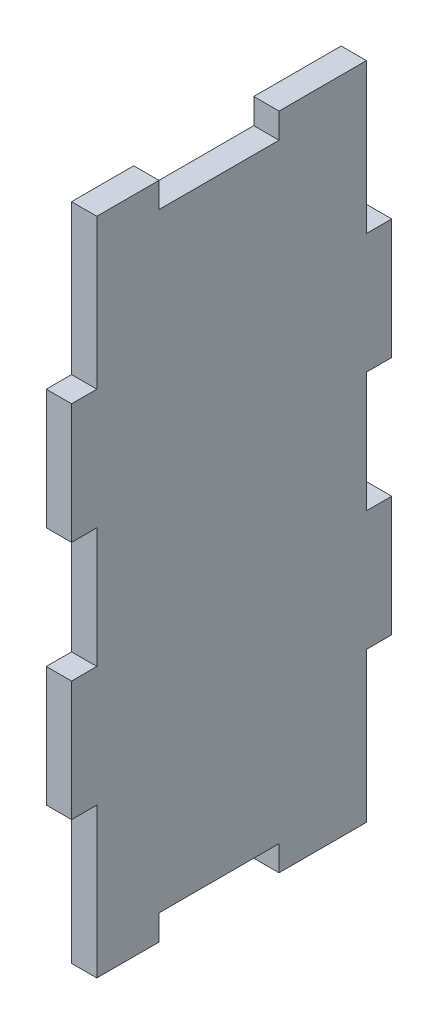
ISO-10303-21;
HEADER;
FILE_DESCRIPTION(('STEP AP214'),'2;1');
FILE_NAME('part.step','',(''),(''),'','','');
FILE_SCHEMA(('AUTOMOTIVE_DESIGN { 1 0 10303 214 1 1 1 1 }'));
ENDSEC;
DATA;
#1=APPLICATION_CONTEXT('core data for automotive mechanical design processes');
#2=APPLICATION_PROTOCOL_DEFINITION('international standard','automotive_design',2000,#1);
#3=PRODUCT_CONTEXT('',#1,'mechanical');
#4=PRODUCT('Part','Part','',(#3));
#5=PRODUCT_RELATED_PRODUCT_CATEGORY('part','',(#4));
#6=PRODUCT_DEFINITION_FORMATION('','',#4);
#7=PRODUCT_DEFINITION_CONTEXT('part definition',#1,'design');
#8=PRODUCT_DEFINITION('design','',#6,#7);
#9=PRODUCT_DEFINITION_SHAPE('','',#8);
#10=(LENGTH_UNIT() NAMED_UNIT(*) SI_UNIT(.MILLI.,.METRE.));
#11=(NAMED_UNIT(*) PLANE_ANGLE_UNIT() SI_UNIT($,.RADIAN.));
#12=(NAMED_UNIT(*) SI_UNIT($,.STERADIAN.) SOLID_ANGLE_UNIT());
#13=UNCERTAINTY_MEASURE_WITH_UNIT(LENGTH_MEASURE(1.E-05),#10,'distance_accuracy_value','');
#14=(GEOMETRIC_REPRESENTATION_CONTEXT(3) GLOBAL_UNCERTAINTY_ASSIGNED_CONTEXT((#13)) GLOBAL_UNIT_ASSIGNED_CONTEXT((#10,
#11,#12)) REPRESENTATION_CONTEXT('',''));
#15=CARTESIAN_POINT('',(0.,0.,0.));
#16=DIRECTION('',(0.,0.,1.));
#17=DIRECTION('',(1.,0.,0.));
#18=AXIS2_PLACEMENT_3D('',#15,#16,#17);
#19=CARTESIAN_POINT('',(3.,37.3293554167655,9.3447237500424));
#20=DIRECTION('',(0.,-1.,0.));
#21=DIRECTION('',(0.,0.,-1.));
#22=AXIS2_PLACEMENT_3D('',#19,#20,#21);
#23=PLANE('',#22);
#24=DIRECTION('',(0.,0.,1.));
#25=VECTOR('',#24,1.);
#26=CARTESIAN_POINT('',(0.,37.3293554167655,9.3447237500424));
#27=LINE('',#26,#25);
#28=CARTESIAN_POINT('',(0.,37.3293554167655,9.3447237500424));
#29=VERTEX_POINT('',#28);
#30=CARTESIAN_POINT('',(0.,37.3293554167655,16.7197237500424));
#31=VERTEX_POINT('',#30);
#32=EDGE_CURVE('E474',#29,#31,#27,.T.);
#33=ORIENTED_EDGE('',*,*,#32,.T.);
#34=DIRECTION('',(-1.,0.,0.));
#35=VECTOR('',#34,1.);
#36=CARTESIAN_POINT('',(3.,37.3293554167655,16.7197237500424));
#37=LINE('',#36,#35);
#38=CARTESIAN_POINT('',(3.,37.3293554167655,16.7197237500424));
#39=VERTEX_POINT('',#38);
#40=EDGE_CURVE('E12',#39,#31,#37,.T.);
#41=ORIENTED_EDGE('',*,*,#40,.F.);
#42=DIRECTION('',(0.,0.,1.));
#43=VECTOR('',#42,1.);
#44=CARTESIAN_POINT('',(3.,37.3293554167655,9.3447237500424));
#45=LINE('',#44,#43);
#46=CARTESIAN_POINT('',(3.,37.3293554167655,9.3447237500424));
#47=VERTEX_POINT('',#46);
#48=EDGE_CURVE('E379',#47,#39,#45,.T.);
#49=ORIENTED_EDGE('',*,*,#48,.F.);
#50=DIRECTION('',(-1.,0.,0.));
#51=VECTOR('',#50,1.);
#52=CARTESIAN_POINT('',(3.,37.3293554167655,9.3447237500424));
#53=LINE('',#52,#51);
#54=EDGE_CURVE('E259',#47,#29,#53,.T.);
#55=ORIENTED_EDGE('',*,*,#54,.T.);
#56=EDGE_LOOP('',(#33,#41,#49,#55));
#57=FACE_BOUND('',#56,.T.);
#58=ADVANCED_FACE('F44',(#57),#23,.F.);
#59=CARTESIAN_POINT('',(3.,37.3293554167655,16.7197237500424));
#60=DIRECTION('',(0.,0.,-1.));
#61=DIRECTION('',(-1.,0.,0.));
#62=AXIS2_PLACEMENT_3D('',#59,#60,#61);
#63=PLANE('',#62);
#64=DIRECTION('',(0.,-1.,0.));
#65=VECTOR('',#64,1.);
#66=CARTESIAN_POINT('',(0.,37.3293554167655,16.7197237500424));
#67=LINE('',#66,#65);
#68=CARTESIAN_POINT('',(0.,19.5543554167655,16.7197237500424));
#69=VERTEX_POINT('',#68);
#70=EDGE_CURVE('E468',#31,#69,#67,.T.);
#71=ORIENTED_EDGE('',*,*,#70,.T.);
#72=DIRECTION('',(-1.,0.,0.));
#73=VECTOR('',#72,1.);
#74=CARTESIAN_POINT('',(3.,19.5543554167655,16.7197237500424));
#75=LINE('',#74,#73);
#76=CARTESIAN_POINT('',(3.,19.5543554167655,16.7197237500424));
#77=VERTEX_POINT('',#76);
#78=EDGE_CURVE('E52',#77,#69,#75,.T.);
#79=ORIENTED_EDGE('',*,*,#78,.F.);
#80=DIRECTION('',(0.,-1.,0.));
#81=VECTOR('',#80,1.);
#82=CARTESIAN_POINT('',(3.,37.3293554167655,16.7197237500424));
#83=LINE('',#82,#81);
#84=EDGE_CURVE('E163',#39,#77,#83,.T.);
#85=ORIENTED_EDGE('',*,*,#84,.F.);
#86=ORIENTED_EDGE('',*,*,#40,.T.);
#87=EDGE_LOOP('',(#71,#79,#85,#86));
#88=FACE_BOUND('',#87,.T.);
#89=ADVANCED_FACE('F536',(#88),#63,.F.);
#90=CARTESIAN_POINT('',(3.,19.5543554167655,16.7197237500424));
#91=DIRECTION('',(0.,-1.,0.));
#92=DIRECTION('',(0.,0.,-1.));
#93=AXIS2_PLACEMENT_3D('',#90,#91,#92);
#94=PLANE('',#93);
#95=DIRECTION('',(0.,0.,1.));
#96=VECTOR('',#95,1.);
#97=CARTESIAN_POINT('',(0.,19.5543554167655,16.7197237500424));
#98=LINE('',#97,#96);
#99=CARTESIAN_POINT('',(0.,19.5543554167655,19.7197237500424));
#100=VERTEX_POINT('',#99);
#101=EDGE_CURVE('E463',#69,#100,#98,.T.);
#102=ORIENTED_EDGE('',*,*,#101,.T.);
#103=DIRECTION('',(-1.,0.,0.));
#104=VECTOR('',#103,1.);
#105=CARTESIAN_POINT('',(3.,19.5543554167655,19.7197237500424));
#106=LINE('',#105,#104);
#107=CARTESIAN_POINT('',(3.,19.5543554167655,19.7197237500424));
#108=VERTEX_POINT('',#107);
#109=EDGE_CURVE('E455',#108,#100,#106,.T.);
#110=ORIENTED_EDGE('',*,*,#109,.F.);
#111=DIRECTION('',(0.,0.,1.));
#112=VECTOR('',#111,1.);
#113=CARTESIAN_POINT('',(3.,19.5543554167655,16.7197237500424));
#114=LINE('',#113,#112);
#115=EDGE_CURVE('E371',#77,#108,#114,.T.);
#116=ORIENTED_EDGE('',*,*,#115,.F.);
#117=ORIENTED_EDGE('',*,*,#78,.T.);
#118=EDGE_LOOP('',(#102,#110,#116,#117));
#119=FACE_BOUND('',#118,.T.);
#120=ADVANCED_FACE('F461',(#119),#94,.F.);
#121=CARTESIAN_POINT('',(3.,19.5543554167655,19.7197237500424));
#122=DIRECTION('',(0.,0.,-1.));
#123=DIRECTION('',(-1.,0.,0.));
#124=AXIS2_PLACEMENT_3D('',#121,#122,#123);
#125=PLANE('',#124);
#126=DIRECTION('',(0.,-1.,0.));
#127=VECTOR('',#126,1.);
#128=CARTESIAN_POINT('',(0.,19.5543554167655,19.7197237500424));
#129=LINE('',#128,#127);
#130=CARTESIAN_POINT('',(0.,5.30435541676549,19.7197237500424));
#131=VERTEX_POINT('',#130);
#132=EDGE_CURVE('E470',#100,#131,#129,.T.);
#133=ORIENTED_EDGE('',*,*,#132,.T.);
#134=DIRECTION('',(-1.,0.,0.));
#135=VECTOR('',#134,1.);
#136=CARTESIAN_POINT('',(3.,5.30435541676549,19.7197237500424));
#137=LINE('',#136,#135);
#138=CARTESIAN_POINT('',(3.,5.30435541676549,19.7197237500424));
#139=VERTEX_POINT('',#138);
#140=EDGE_CURVE('E452',#139,#131,#137,.T.);
#141=ORIENTED_EDGE('',*,*,#140,.F.);
#142=DIRECTION('',(0.,-1.,0.));
#143=VECTOR('',#142,1.);
#144=CARTESIAN_POINT('',(3.,19.5543554167655,19.7197237500424));
#145=LINE('',#144,#143);
#146=EDGE_CURVE('E367',#108,#139,#145,.T.);
#147=ORIENTED_EDGE('',*,*,#146,.F.);
#148=ORIENTED_EDGE('',*,*,#109,.T.);
#149=EDGE_LOOP('',(#133,#141,#147,#148));
#150=FACE_BOUND('',#149,.T.);
#151=ADVANCED_FACE('F543',(#150),#125,.F.);
#152=CARTESIAN_POINT('',(3.,5.30435541676549,19.7197237500424));
#153=DIRECTION('',(0.,1.,0.));
#154=DIRECTION('',(0.,0.,1.));
#155=AXIS2_PLACEMENT_3D('',#152,#153,#154);
#156=PLANE('',#155);
#157=DIRECTION('',(0.,0.,-1.));
#158=VECTOR('',#157,1.);
#159=CARTESIAN_POINT('',(0.,5.30435541676549,19.7197237500424));
#160=LINE('',#159,#158);
#161=CARTESIAN_POINT('',(0.,5.30435541676549,16.7197237500424));
#162=VERTEX_POINT('',#161);
#163=EDGE_CURVE('E472',#131,#162,#160,.T.);
#164=ORIENTED_EDGE('',*,*,#163,.T.);
#165=DIRECTION('',(-1.,0.,0.));
#166=VECTOR('',#165,1.);
#167=CARTESIAN_POINT('',(3.,5.30435541676549,16.7197237500424));
#168=LINE('',#167,#166);
#169=CARTESIAN_POINT('',(3.,5.30435541676549,16.7197237500424));
#170=VERTEX_POINT('',#169);
#171=EDGE_CURVE('E449',#170,#162,#168,.T.);
#172=ORIENTED_EDGE('',*,*,#171,.F.);
#173=DIRECTION('',(0.,0.,-1.));
#174=VECTOR('',#173,1.);
#175=CARTESIAN_POINT('',(3.,5.30435541676549,19.7197237500424));
#176=LINE('',#175,#174);
#177=EDGE_CURVE('E364',#139,#170,#176,.T.);
#178=ORIENTED_EDGE('',*,*,#177,.F.);
#179=ORIENTED_EDGE('',*,*,#140,.T.);
#180=EDGE_LOOP('',(#164,#172,#178,#179));
#181=FACE_BOUND('',#180,.T.);
#182=ADVANCED_FACE('F548',(#181),#156,.F.);
#183=CARTESIAN_POINT('',(3.,5.30435541676549,16.7197237500424));
#184=DIRECTION('',(0.,0.,-1.));
#185=DIRECTION('',(-1.,0.,0.));
#186=AXIS2_PLACEMENT_3D('',#183,#184,#185);
#187=PLANE('',#186);
#188=DIRECTION('',(0.,-1.,0.));
#189=VECTOR('',#188,1.);
#190=CARTESIAN_POINT('',(0.,5.30435541676549,16.7197237500424));
#191=LINE('',#190,#189);
#192=CARTESIAN_POINT('',(0.,-8.94564458323451,16.7197237500424));
#193=VERTEX_POINT('',#192);
#194=EDGE_CURVE('E478',#162,#193,#191,.T.);
#195=ORIENTED_EDGE('',*,*,#194,.T.);
#196=DIRECTION('',(-1.,0.,0.));
#197=VECTOR('',#196,1.);
#198=CARTESIAN_POINT('',(3.,-8.94564458323451,16.7197237500424));
#199=LINE('',#198,#197);
#200=CARTESIAN_POINT('',(3.,-8.94564458323451,16.7197237500424));
#201=VERTEX_POINT('',#200);
#202=EDGE_CURVE('E446',#201,#193,#199,.T.);
#203=ORIENTED_EDGE('',*,*,#202,.F.);
#204=DIRECTION('',(0.,-1.,0.));
#205=VECTOR('',#204,1.);
#206=CARTESIAN_POINT('',(3.,5.30435541676549,16.7197237500424));
#207=LINE('',#206,#205);
#208=EDGE_CURVE('E356',#170,#201,#207,.T.);
#209=ORIENTED_EDGE('',*,*,#208,.F.);
#210=ORIENTED_EDGE('',*,*,#171,.T.);
#211=EDGE_LOOP('',(#195,#203,#209,#210));
#212=FACE_BOUND('',#211,.T.);
#213=ADVANCED_FACE('F552',(#212),#187,.F.);
#214=CARTESIAN_POINT('',(3.,-8.94564458323451,16.7197237500424));
#215=DIRECTION('',(0.,-1.,0.));
#216=DIRECTION('',(0.,0.,-1.));
#217=AXIS2_PLACEMENT_3D('',#214,#215,#216);
#218=PLANE('',#217);
#219=DIRECTION('',(0.,0.,1.));
#220=VECTOR('',#219,1.);
#221=CARTESIAN_POINT('',(0.,-8.94564458323451,16.7197237500424));
#222=LINE('',#221,#220);
#223=CARTESIAN_POINT('',(0.,-8.94564458323451,19.7197237500424));
#224=VERTEX_POINT('',#223);
#225=EDGE_CURVE('E480',#193,#224,#222,.T.);
#226=ORIENTED_EDGE('',*,*,#225,.T.);
#227=DIRECTION('',(-1.,0.,0.));
#228=VECTOR('',#227,1.);
#229=CARTESIAN_POINT('',(3.,-8.94564458323451,19.7197237500424));
#230=LINE('',#229,#228);
#231=CARTESIAN_POINT('',(3.,-8.94564458323451,19.7197237500424));
#232=VERTEX_POINT('',#231);
#233=EDGE_CURVE('E443',#232,#224,#230,.T.);
#234=ORIENTED_EDGE('',*,*,#233,.F.);
#235=DIRECTION('',(0.,0.,1.));
#236=VECTOR('',#235,1.);
#237=CARTESIAN_POINT('',(3.,-8.94564458323451,16.7197237500424));
#238=LINE('',#237,#236);
#239=EDGE_CURVE('E352',#201,#232,#238,.T.);
#240=ORIENTED_EDGE('',*,*,#239,.F.);
#241=ORIENTED_EDGE('',*,*,#202,.T.);
#242=EDGE_LOOP('',(#226,#234,#240,#241));
#243=FACE_BOUND('',#242,.T.);
#244=ADVANCED_FACE('F556',(#243),#218,.F.);
#245=CARTESIAN_POINT('',(3.,-8.94564458323451,19.7197237500424));
#246=DIRECTION('',(0.,0.,-1.));
#247=DIRECTION('',(-1.,0.,0.));
#248=AXIS2_PLACEMENT_3D('',#245,#246,#247);
#249=PLANE('',#248);
#250=DIRECTION('',(0.,-1.,0.));
#251=VECTOR('',#250,1.);
#252=CARTESIAN_POINT('',(0.,-8.94564458323451,19.7197237500424));
#253=LINE('',#252,#251);
#254=CARTESIAN_POINT('',(0.,-23.1956445832345,19.7197237500424));
#255=VERTEX_POINT('',#254);
#256=EDGE_CURVE('E482',#224,#255,#253,.T.);
#257=ORIENTED_EDGE('',*,*,#256,.T.);
#258=DIRECTION('',(-1.,0.,0.));
#259=VECTOR('',#258,1.);
#260=CARTESIAN_POINT('',(3.,-23.1956445832345,19.7197237500424));
#261=LINE('',#260,#259);
#262=CARTESIAN_POINT('',(3.,-23.1956445832345,19.7197237500424));
#263=VERTEX_POINT('',#262);
#264=EDGE_CURVE('E440',#263,#255,#261,.T.);
#265=ORIENTED_EDGE('',*,*,#264,.F.);
#266=DIRECTION('',(0.,-1.,0.));
#267=VECTOR('',#266,1.);
#268=CARTESIAN_POINT('',(3.,-8.94564458323451,19.7197237500424));
#269=LINE('',#268,#267);
#270=EDGE_CURVE('E348',#232,#263,#269,.T.);
#271=ORIENTED_EDGE('',*,*,#270,.F.);
#272=ORIENTED_EDGE('',*,*,#233,.T.);
#273=EDGE_LOOP('',(#257,#265,#271,#272));
#274=FACE_BOUND('',#273,.T.);
#275=ADVANCED_FACE('F560',(#274),#249,.F.);
#276=CARTESIAN_POINT('',(3.,-23.1956445832345,19.7197237500424));
#277=DIRECTION('',(0.,1.,0.));
#278=DIRECTION('',(0.,0.,1.));
#279=AXIS2_PLACEMENT_3D('',#276,#277,#278);
#280=PLANE('',#279);
#281=DIRECTION('',(0.,0.,-1.));
#282=VECTOR('',#281,1.);
#283=CARTESIAN_POINT('',(0.,-23.1956445832345,19.7197237500424));
#284=LINE('',#283,#282);
#285=CARTESIAN_POINT('',(0.,-23.1956445832345,16.7197237500424));
#286=VERTEX_POINT('',#285);
#287=EDGE_CURVE('E484',#255,#286,#284,.T.);
#288=ORIENTED_EDGE('',*,*,#287,.T.);
#289=DIRECTION('',(-1.,0.,0.));
#290=VECTOR('',#289,1.);
#291=CARTESIAN_POINT('',(3.,-23.1956445832345,16.7197237500424));
#292=LINE('',#291,#290);
#293=CARTESIAN_POINT('',(3.,-23.1956445832345,16.7197237500424));
#294=VERTEX_POINT('',#293);
#295=EDGE_CURVE('E437',#294,#286,#292,.T.);
#296=ORIENTED_EDGE('',*,*,#295,.F.);
#297=DIRECTION('',(0.,0.,-1.));
#298=VECTOR('',#297,1.);
#299=CARTESIAN_POINT('',(3.,-23.1956445832345,19.7197237500424));
#300=LINE('',#299,#298);
#301=EDGE_CURVE('E345',#263,#294,#300,.T.);
#302=ORIENTED_EDGE('',*,*,#301,.F.);
#303=ORIENTED_EDGE('',*,*,#264,.T.);
#304=EDGE_LOOP('',(#288,#296,#302,#303));
#305=FACE_BOUND('',#304,.T.);
#306=ADVANCED_FACE('F564',(#305),#280,.F.);
#307=CARTESIAN_POINT('',(3.,-37.4456445832345,16.7197237500424));
#308=DIRECTION('',(0.,0.,-1.));
#309=DIRECTION('',(-1.,0.,0.));
#310=AXIS2_PLACEMENT_3D('',#307,#308,#309);
#311=PLANE('',#310);
#312=DIRECTION('',(0.,-1.,0.));
#313=VECTOR('',#312,1.);
#314=CARTESIAN_POINT('',(0.,-37.4456445832345,16.7197237500424));
#315=LINE('',#314,#313);
#316=CARTESIAN_POINT('',(0.,-40.9706445832345,16.7197237500424));
#317=VERTEX_POINT('',#316);
#318=EDGE_CURVE('E487',#286,#317,#315,.T.);
#319=ORIENTED_EDGE('',*,*,#318,.T.);
#320=DIRECTION('',(-1.,0.,0.));
#321=VECTOR('',#320,1.);
#322=CARTESIAN_POINT('',(3.,-40.9706445832345,16.7197237500424));
#323=LINE('',#322,#321);
#324=CARTESIAN_POINT('',(3.,-40.9706445832345,16.7197237500424));
#325=VERTEX_POINT('',#324);
#326=EDGE_CURVE('E434',#325,#317,#323,.T.);
#327=ORIENTED_EDGE('',*,*,#326,.F.);
#328=DIRECTION('',(0.,-1.,0.));
#329=VECTOR('',#328,1.);
#330=CARTESIAN_POINT('',(3.,-23.1956445832345,16.7197237500424));
#331=LINE('',#330,#329);
#332=EDGE_CURVE('E337',#294,#325,#331,.T.);
#333=ORIENTED_EDGE('',*,*,#332,.F.);
#334=ORIENTED_EDGE('',*,*,#295,.T.);
#335=EDGE_LOOP('',(#319,#327,#333,#334));
#336=FACE_BOUND('',#335,.T.);
#337=ADVANCED_FACE('F568',(#336),#311,.F.);
#338=CARTESIAN_POINT('',(3.,-40.9706445832345,16.7197237500424));
#339=DIRECTION('',(0.,1.,0.));
#340=DIRECTION('',(0.,0.,1.));
#341=AXIS2_PLACEMENT_3D('',#338,#339,#340);
#342=PLANE('',#341);
#343=DIRECTION('',(0.,0.,-1.));
#344=VECTOR('',#343,1.);
#345=CARTESIAN_POINT('',(0.,-40.9706445832345,16.7197237500424));
#346=LINE('',#345,#344);
#347=CARTESIAN_POINT('',(0.,-40.9706445832345,9.3447237500424));
#348=VERTEX_POINT('',#347);
#349=EDGE_CURVE('E489',#317,#348,#346,.T.);
#350=ORIENTED_EDGE('',*,*,#349,.T.);
#351=DIRECTION('',(-1.,0.,0.));
#352=VECTOR('',#351,1.);
#353=CARTESIAN_POINT('',(3.,-40.9706445832345,9.3447237500424));
#354=LINE('',#353,#352);
#355=CARTESIAN_POINT('',(3.,-40.9706445832345,9.3447237500424));
#356=VERTEX_POINT('',#355);
#357=EDGE_CURVE('E431',#356,#348,#354,.T.);
#358=ORIENTED_EDGE('',*,*,#357,.F.);
#359=DIRECTION('',(0.,0.,-1.));
#360=VECTOR('',#359,1.);
#361=CARTESIAN_POINT('',(3.,-40.9706445832345,16.7197237500424));
#362=LINE('',#361,#360);
#363=EDGE_CURVE('E333',#325,#356,#362,.T.);
#364=ORIENTED_EDGE('',*,*,#363,.F.);
#365=ORIENTED_EDGE('',*,*,#326,.T.);
#366=EDGE_LOOP('',(#350,#358,#364,#365));
#367=FACE_BOUND('',#366,.T.);
#368=ADVANCED_FACE('F572',(#367),#342,.F.);
#369=CARTESIAN_POINT('',(3.,-40.9706445832345,9.3447237500424));
#370=DIRECTION('',(0.,0.,1.));
#371=DIRECTION('',(1.,0.,0.));
#372=AXIS2_PLACEMENT_3D('',#369,#370,#371);
#373=PLANE('',#372);
#374=DIRECTION('',(0.,1.,0.));
#375=VECTOR('',#374,1.);
#376=CARTESIAN_POINT('',(0.,-40.9706445832345,9.3447237500424));
#377=LINE('',#376,#375);
#378=CARTESIAN_POINT('',(0.,-37.9706445832345,9.3447237500424));
#379=VERTEX_POINT('',#378);
#380=EDGE_CURVE('E491',#348,#379,#377,.T.);
#381=ORIENTED_EDGE('',*,*,#380,.T.);
#382=DIRECTION('',(-1.,0.,0.));
#383=VECTOR('',#382,1.);
#384=CARTESIAN_POINT('',(3.,-37.9706445832345,9.3447237500424));
#385=LINE('',#384,#383);
#386=CARTESIAN_POINT('',(3.,-37.9706445832345,9.3447237500424));
#387=VERTEX_POINT('',#386);
#388=EDGE_CURVE('E428',#387,#379,#385,.T.);
#389=ORIENTED_EDGE('',*,*,#388,.F.);
#390=DIRECTION('',(0.,1.,0.));
#391=VECTOR('',#390,1.);
#392=CARTESIAN_POINT('',(3.,-40.9706445832345,9.3447237500424));
#393=LINE('',#392,#391);
#394=EDGE_CURVE('E329',#356,#387,#393,.T.);
#395=ORIENTED_EDGE('',*,*,#394,.F.);
#396=ORIENTED_EDGE('',*,*,#357,.T.);
#397=EDGE_LOOP('',(#381,#389,#395,#396));
#398=FACE_BOUND('',#397,.T.);
#399=ADVANCED_FACE('F576',(#398),#373,.F.);
#400=CARTESIAN_POINT('',(3.,-37.9706445832345,9.3447237500424));
#401=DIRECTION('',(0.,1.,0.));
#402=DIRECTION('',(0.,0.,1.));
#403=AXIS2_PLACEMENT_3D('',#400,#401,#402);
#404=PLANE('',#403);
#405=DIRECTION('',(0.,0.,-1.));
#406=VECTOR('',#405,1.);
#407=CARTESIAN_POINT('',(0.,-37.9706445832345,9.3447237500424));
#408=LINE('',#407,#406);
#409=CARTESIAN_POINT('',(0.,-37.9706445832345,-4.9052762499576));
#410=VERTEX_POINT('',#409);
#411=EDGE_CURVE('E493',#379,#410,#408,.T.);
#412=ORIENTED_EDGE('',*,*,#411,.T.);
#413=DIRECTION('',(-1.,0.,0.));
#414=VECTOR('',#413,1.);
#415=CARTESIAN_POINT('',(3.,-37.9706445832345,-4.9052762499576));
#416=LINE('',#415,#414);
#417=CARTESIAN_POINT('',(3.,-37.9706445832345,-4.9052762499576));
#418=VERTEX_POINT('',#417);
#419=EDGE_CURVE('E425',#418,#410,#416,.T.);
#420=ORIENTED_EDGE('',*,*,#419,.F.);
#421=DIRECTION('',(0.,0.,-1.));
#422=VECTOR('',#421,1.);
#423=CARTESIAN_POINT('',(3.,-37.9706445832345,9.3447237500424));
#424=LINE('',#423,#422);
#425=EDGE_CURVE('E326',#387,#418,#424,.T.);
#426=ORIENTED_EDGE('',*,*,#425,.F.);
#427=ORIENTED_EDGE('',*,*,#388,.T.);
#428=EDGE_LOOP('',(#412,#420,#426,#427));
#429=FACE_BOUND('',#428,.T.);
#430=ADVANCED_FACE('F580',(#429),#404,.F.);
#431=CARTESIAN_POINT('',(3.,-37.9706445832345,-4.9052762499576));
#432=DIRECTION('',(0.,0.,-1.));
#433=DIRECTION('',(-1.,0.,0.));
#434=AXIS2_PLACEMENT_3D('',#431,#432,#433);
#435=PLANE('',#434);
#436=DIRECTION('',(0.,-1.,0.));
#437=VECTOR('',#436,1.);
#438=CARTESIAN_POINT('',(0.,-37.9706445832345,-4.9052762499576));
#439=LINE('',#438,#437);
#440=CARTESIAN_POINT('',(0.,-40.9706445832345,-4.9052762499576));
#441=VERTEX_POINT('',#440);
#442=EDGE_CURVE('E495',#410,#441,#439,.T.);
#443=ORIENTED_EDGE('',*,*,#442,.T.);
#444=DIRECTION('',(-1.,0.,0.));
#445=VECTOR('',#444,1.);
#446=CARTESIAN_POINT('',(3.,-40.9706445832345,-4.9052762499576));
#447=LINE('',#446,#445);
#448=CARTESIAN_POINT('',(3.,-40.9706445832345,-4.9052762499576));
#449=VERTEX_POINT('',#448);
#450=EDGE_CURVE('E422',#449,#441,#447,.T.);
#451=ORIENTED_EDGE('',*,*,#450,.F.);
#452=DIRECTION('',(0.,-1.,0.));
#453=VECTOR('',#452,1.);
#454=CARTESIAN_POINT('',(3.,-37.9706445832345,-4.9052762499576));
#455=LINE('',#454,#453);
#456=EDGE_CURVE('E318',#418,#449,#455,.T.);
#457=ORIENTED_EDGE('',*,*,#456,.F.);
#458=ORIENTED_EDGE('',*,*,#419,.T.);
#459=EDGE_LOOP('',(#443,#451,#457,#458));
#460=FACE_BOUND('',#459,.T.);
#461=ADVANCED_FACE('F584',(#460),#435,.F.);
#462=CARTESIAN_POINT('',(3.,-40.9706445832345,-4.9052762499576));
#463=DIRECTION('',(0.,1.,0.));
#464=DIRECTION('',(0.,0.,1.));
#465=AXIS2_PLACEMENT_3D('',#462,#463,#464);
#466=PLANE('',#465);
#467=DIRECTION('',(0.,0.,-1.));
#468=VECTOR('',#467,1.);
#469=CARTESIAN_POINT('',(0.,-40.9706445832345,-4.9052762499576));
#470=LINE('',#469,#468);
#471=CARTESIAN_POINT('',(0.,-40.9706445832345,-15.2802762499576));
#472=VERTEX_POINT('',#471);
#473=EDGE_CURVE('E497',#441,#472,#470,.T.);
#474=ORIENTED_EDGE('',*,*,#473,.T.);
#475=DIRECTION('',(-1.,0.,0.));
#476=VECTOR('',#475,1.);
#477=CARTESIAN_POINT('',(3.,-40.9706445832345,-15.2802762499576));
#478=LINE('',#477,#476);
#479=CARTESIAN_POINT('',(3.,-40.9706445832345,-15.2802762499576));
#480=VERTEX_POINT('',#479);
#481=EDGE_CURVE('E419',#480,#472,#478,.T.);
#482=ORIENTED_EDGE('',*,*,#481,.F.);
#483=DIRECTION('',(0.,0.,-1.));
#484=VECTOR('',#483,1.);
#485=CARTESIAN_POINT('',(3.,-40.9706445832345,-4.9052762499576));
#486=LINE('',#485,#484);
#487=EDGE_CURVE('E314',#449,#480,#486,.T.);
#488=ORIENTED_EDGE('',*,*,#487,.F.);
#489=ORIENTED_EDGE('',*,*,#450,.T.);
#490=EDGE_LOOP('',(#474,#482,#488,#489));
#491=FACE_BOUND('',#490,.T.);
#492=ADVANCED_FACE('F588',(#491),#466,.F.);
#493=CARTESIAN_POINT('',(3.,-40.9706445832345,-15.2802762499576));
#494=DIRECTION('',(0.,0.,1.));
#495=DIRECTION('',(1.,0.,0.));
#496=AXIS2_PLACEMENT_3D('',#493,#494,#495);
#497=PLANE('',#496);
#498=DIRECTION('',(0.,1.,0.));
#499=VECTOR('',#498,1.);
#500=CARTESIAN_POINT('',(0.,-40.9706445832345,-15.2802762499576));
#501=LINE('',#500,#499);
#502=CARTESIAN_POINT('',(0.,-23.1956445832345,-15.2802762499576));
#503=VERTEX_POINT('',#502);
#504=EDGE_CURVE('E499',#472,#503,#501,.T.);
#505=ORIENTED_EDGE('',*,*,#504,.T.);
#506=DIRECTION('',(-1.,0.,0.));
#507=VECTOR('',#506,1.);
#508=CARTESIAN_POINT('',(3.,-23.1956445832345,-15.2802762499576));
#509=LINE('',#508,#507);
#510=CARTESIAN_POINT('',(3.,-23.1956445832345,-15.2802762499576));
#511=VERTEX_POINT('',#510);
#512=EDGE_CURVE('E416',#511,#503,#509,.T.);
#513=ORIENTED_EDGE('',*,*,#512,.F.);
#514=DIRECTION('',(0.,1.,0.));
#515=VECTOR('',#514,1.);
#516=CARTESIAN_POINT('',(3.,-40.9706445832345,-15.2802762499576));
#517=LINE('',#516,#515);
#518=EDGE_CURVE('E310',#480,#511,#517,.T.);
#519=ORIENTED_EDGE('',*,*,#518,.F.);
#520=ORIENTED_EDGE('',*,*,#481,.T.);
#521=EDGE_LOOP('',(#505,#513,#519,#520));
#522=FACE_BOUND('',#521,.T.);
#523=ADVANCED_FACE('F592',(#522),#497,.F.);
#524=CARTESIAN_POINT('',(3.,-23.1956445832345,-15.2802762499576));
#525=DIRECTION('',(0.,1.,0.));
#526=DIRECTION('',(0.,0.,1.));
#527=AXIS2_PLACEMENT_3D('',#524,#525,#526);
#528=PLANE('',#527);
#529=DIRECTION('',(0.,0.,-1.));
#530=VECTOR('',#529,1.);
#531=CARTESIAN_POINT('',(0.,-23.1956445832345,-15.2802762499576));
#532=LINE('',#531,#530);
#533=CARTESIAN_POINT('',(0.,-23.1956445832345,-18.2802762499576));
#534=VERTEX_POINT('',#533);
#535=EDGE_CURVE('E501',#503,#534,#532,.T.);
#536=ORIENTED_EDGE('',*,*,#535,.T.);
#537=DIRECTION('',(-1.,0.,0.));
#538=VECTOR('',#537,1.);
#539=CARTESIAN_POINT('',(3.,-23.1956445832345,-18.2802762499576));
#540=LINE('',#539,#538);
#541=CARTESIAN_POINT('',(3.,-23.1956445832345,-18.2802762499576));
#542=VERTEX_POINT('',#541);
#543=EDGE_CURVE('E413',#542,#534,#540,.T.);
#544=ORIENTED_EDGE('',*,*,#543,.F.);
#545=DIRECTION('',(0.,0.,-1.));
#546=VECTOR('',#545,1.);
#547=CARTESIAN_POINT('',(3.,-23.1956445832345,-15.2802762499576));
#548=LINE('',#547,#546);
#549=EDGE_CURVE('E307',#511,#542,#548,.T.);
#550=ORIENTED_EDGE('',*,*,#549,.F.);
#551=ORIENTED_EDGE('',*,*,#512,.T.);
#552=EDGE_LOOP('',(#536,#544,#550,#551));
#553=FACE_BOUND('',#552,.T.);
#554=ADVANCED_FACE('F596',(#553),#528,.F.);
#555=CARTESIAN_POINT('',(3.,-23.1956445832345,-18.2802762499576));
#556=DIRECTION('',(0.,0.,1.));
#557=DIRECTION('',(1.,0.,0.));
#558=AXIS2_PLACEMENT_3D('',#555,#556,#557);
#559=PLANE('',#558);
#560=DIRECTION('',(0.,1.,0.));
#561=VECTOR('',#560,1.);
#562=CARTESIAN_POINT('',(0.,-23.1956445832345,-18.2802762499576));
#563=LINE('',#562,#561);
#564=CARTESIAN_POINT('',(0.,-8.94564458323451,-18.2802762499576));
#565=VERTEX_POINT('',#564);
#566=EDGE_CURVE('E503',#534,#565,#563,.T.);
#567=ORIENTED_EDGE('',*,*,#566,.T.);
#568=DIRECTION('',(-1.,0.,0.));
#569=VECTOR('',#568,1.);
#570=CARTESIAN_POINT('',(3.,-8.94564458323451,-18.2802762499576));
#571=LINE('',#570,#569);
#572=CARTESIAN_POINT('',(3.,-8.94564458323451,-18.2802762499576));
#573=VERTEX_POINT('',#572);
#574=EDGE_CURVE('E410',#573,#565,#571,.T.);
#575=ORIENTED_EDGE('',*,*,#574,.F.);
#576=DIRECTION('',(0.,1.,0.));
#577=VECTOR('',#576,1.);
#578=CARTESIAN_POINT('',(3.,-23.1956445832345,-18.2802762499576));
#579=LINE('',#578,#577);
#580=EDGE_CURVE('E299',#542,#573,#579,.T.);
#581=ORIENTED_EDGE('',*,*,#580,.F.);
#582=ORIENTED_EDGE('',*,*,#543,.T.);
#583=EDGE_LOOP('',(#567,#575,#581,#582));
#584=FACE_BOUND('',#583,.T.);
#585=ADVANCED_FACE('F600',(#584),#559,.F.);
#586=CARTESIAN_POINT('',(3.,-8.94564458323451,-18.2802762499576));
#587=DIRECTION('',(0.,-1.,0.));
#588=DIRECTION('',(0.,0.,-1.));
#589=AXIS2_PLACEMENT_3D('',#586,#587,#588);
#590=PLANE('',#589);
#591=DIRECTION('',(0.,0.,1.));
#592=VECTOR('',#591,1.);
#593=CARTESIAN_POINT('',(0.,-8.94564458323451,-18.2802762499576));
#594=LINE('',#593,#592);
#595=CARTESIAN_POINT('',(0.,-8.94564458323451,-15.2802762499576));
#596=VERTEX_POINT('',#595);
#597=EDGE_CURVE('E505',#565,#596,#594,.T.);
#598=ORIENTED_EDGE('',*,*,#597,.T.);
#599=DIRECTION('',(-1.,0.,0.));
#600=VECTOR('',#599,1.);
#601=CARTESIAN_POINT('',(3.,-8.94564458323451,-15.2802762499576));
#602=LINE('',#601,#600);
#603=CARTESIAN_POINT('',(3.,-8.94564458323451,-15.2802762499576));
#604=VERTEX_POINT('',#603);
#605=EDGE_CURVE('E407',#604,#596,#602,.T.);
#606=ORIENTED_EDGE('',*,*,#605,.F.);
#607=DIRECTION('',(0.,0.,1.));
#608=VECTOR('',#607,1.);
#609=CARTESIAN_POINT('',(3.,-8.94564458323451,-18.2802762499576));
#610=LINE('',#609,#608);
#611=EDGE_CURVE('E295',#573,#604,#610,.T.);
#612=ORIENTED_EDGE('',*,*,#611,.F.);
#613=ORIENTED_EDGE('',*,*,#574,.T.);
#614=EDGE_LOOP('',(#598,#606,#612,#613));
#615=FACE_BOUND('',#614,.T.);
#616=ADVANCED_FACE('F604',(#615),#590,.F.);
#617=CARTESIAN_POINT('',(3.,-8.94564458323451,-15.2802762499576));
#618=DIRECTION('',(0.,0.,1.));
#619=DIRECTION('',(1.,0.,0.));
#620=AXIS2_PLACEMENT_3D('',#617,#618,#619);
#621=PLANE('',#620);
#622=DIRECTION('',(0.,1.,0.));
#623=VECTOR('',#622,1.);
#624=CARTESIAN_POINT('',(0.,-8.94564458323451,-15.2802762499576));
#625=LINE('',#624,#623);
#626=CARTESIAN_POINT('',(0.,5.30435541676549,-15.2802762499576));
#627=VERTEX_POINT('',#626);
#628=EDGE_CURVE('E507',#596,#627,#625,.T.);
#629=ORIENTED_EDGE('',*,*,#628,.T.);
#630=DIRECTION('',(-1.,0.,0.));
#631=VECTOR('',#630,1.);
#632=CARTESIAN_POINT('',(3.,5.30435541676549,-15.2802762499576));
#633=LINE('',#632,#631);
#634=CARTESIAN_POINT('',(3.,5.30435541676549,-15.2802762499576));
#635=VERTEX_POINT('',#634);
#636=EDGE_CURVE('E404',#635,#627,#633,.T.);
#637=ORIENTED_EDGE('',*,*,#636,.F.);
#638=DIRECTION('',(0.,1.,0.));
#639=VECTOR('',#638,1.);
#640=CARTESIAN_POINT('',(3.,-8.94564458323451,-15.2802762499576));
#641=LINE('',#640,#639);
#642=EDGE_CURVE('E291',#604,#635,#641,.T.);
#643=ORIENTED_EDGE('',*,*,#642,.F.);
#644=ORIENTED_EDGE('',*,*,#605,.T.);
#645=EDGE_LOOP('',(#629,#637,#643,#644));
#646=FACE_BOUND('',#645,.T.);
#647=ADVANCED_FACE('F608',(#646),#621,.F.);
#648=CARTESIAN_POINT('',(3.,5.30435541676549,-15.2802762499576));
#649=DIRECTION('',(0.,1.,0.));
#650=DIRECTION('',(0.,0.,1.));
#651=AXIS2_PLACEMENT_3D('',#648,#649,#650);
#652=PLANE('',#651);
#653=DIRECTION('',(0.,0.,-1.));
#654=VECTOR('',#653,1.);
#655=CARTESIAN_POINT('',(0.,5.30435541676549,-15.2802762499576));
#656=LINE('',#655,#654);
#657=CARTESIAN_POINT('',(0.,5.30435541676549,-18.2802762499576));
#658=VERTEX_POINT('',#657);
#659=EDGE_CURVE('E509',#627,#658,#656,.T.);
#660=ORIENTED_EDGE('',*,*,#659,.T.);
#661=DIRECTION('',(-1.,0.,0.));
#662=VECTOR('',#661,1.);
#663=CARTESIAN_POINT('',(3.,5.30435541676549,-18.2802762499576));
#664=LINE('',#663,#662);
#665=CARTESIAN_POINT('',(3.,5.30435541676549,-18.2802762499576));
#666=VERTEX_POINT('',#665);
#667=EDGE_CURVE('E401',#666,#658,#664,.T.);
#668=ORIENTED_EDGE('',*,*,#667,.F.);
#669=DIRECTION('',(0.,0.,-1.));
#670=VECTOR('',#669,1.);
#671=CARTESIAN_POINT('',(3.,5.30435541676549,-15.2802762499576));
#672=LINE('',#671,#670);
#673=EDGE_CURVE('E288',#635,#666,#672,.T.);
#674=ORIENTED_EDGE('',*,*,#673,.F.);
#675=ORIENTED_EDGE('',*,*,#636,.T.);
#676=EDGE_LOOP('',(#660,#668,#674,#675));
#677=FACE_BOUND('',#676,.T.);
#678=ADVANCED_FACE('F612',(#677),#652,.F.);
#679=CARTESIAN_POINT('',(3.,5.30435541676549,-18.2802762499576));
#680=DIRECTION('',(0.,0.,1.));
#681=DIRECTION('',(1.,0.,0.));
#682=AXIS2_PLACEMENT_3D('',#679,#680,#681);
#683=PLANE('',#682);
#684=DIRECTION('',(0.,1.,0.));
#685=VECTOR('',#684,1.);
#686=CARTESIAN_POINT('',(0.,5.30435541676549,-18.2802762499576));
#687=LINE('',#686,#685);
#688=CARTESIAN_POINT('',(0.,19.5543554167655,-18.2802762499576));
#689=VERTEX_POINT('',#688);
#690=EDGE_CURVE('E511',#658,#689,#687,.T.);
#691=ORIENTED_EDGE('',*,*,#690,.T.);
#692=DIRECTION('',(-1.,0.,0.));
#693=VECTOR('',#692,1.);
#694=CARTESIAN_POINT('',(3.,19.5543554167655,-18.2802762499576));
#695=LINE('',#694,#693);
#696=CARTESIAN_POINT('',(3.,19.5543554167655,-18.2802762499576));
#697=VERTEX_POINT('',#696);
#698=EDGE_CURVE('E398',#697,#689,#695,.T.);
#699=ORIENTED_EDGE('',*,*,#698,.F.);
#700=DIRECTION('',(0.,1.,0.));
#701=VECTOR('',#700,1.);
#702=CARTESIAN_POINT('',(3.,5.30435541676549,-18.2802762499576));
#703=LINE('',#702,#701);
#704=EDGE_CURVE('E280',#666,#697,#703,.T.);
#705=ORIENTED_EDGE('',*,*,#704,.F.);
#706=ORIENTED_EDGE('',*,*,#667,.T.);
#707=EDGE_LOOP('',(#691,#699,#705,#706));
#708=FACE_BOUND('',#707,.T.);
#709=ADVANCED_FACE('F616',(#708),#683,.F.);
#710=CARTESIAN_POINT('',(3.,19.5543554167655,-18.2802762499576));
#711=DIRECTION('',(0.,-1.,0.));
#712=DIRECTION('',(0.,0.,-1.));
#713=AXIS2_PLACEMENT_3D('',#710,#711,#712);
#714=PLANE('',#713);
#715=DIRECTION('',(0.,0.,1.));
#716=VECTOR('',#715,1.);
#717=CARTESIAN_POINT('',(0.,19.5543554167655,-18.2802762499576));
#718=LINE('',#717,#716);
#719=CARTESIAN_POINT('',(0.,19.5543554167655,-15.2802762499576));
#720=VERTEX_POINT('',#719);
#721=EDGE_CURVE('E513',#689,#720,#718,.T.);
#722=ORIENTED_EDGE('',*,*,#721,.T.);
#723=DIRECTION('',(-1.,0.,0.));
#724=VECTOR('',#723,1.);
#725=CARTESIAN_POINT('',(3.,19.5543554167655,-15.2802762499576));
#726=LINE('',#725,#724);
#727=CARTESIAN_POINT('',(3.,19.5543554167655,-15.2802762499576));
#728=VERTEX_POINT('',#727);
#729=EDGE_CURVE('E395',#728,#720,#726,.T.);
#730=ORIENTED_EDGE('',*,*,#729,.F.);
#731=DIRECTION('',(0.,0.,1.));
#732=VECTOR('',#731,1.);
#733=CARTESIAN_POINT('',(3.,19.5543554167655,-18.2802762499576));
#734=LINE('',#733,#732);
#735=EDGE_CURVE('E276',#697,#728,#734,.T.);
#736=ORIENTED_EDGE('',*,*,#735,.F.);
#737=ORIENTED_EDGE('',*,*,#698,.T.);
#738=EDGE_LOOP('',(#722,#730,#736,#737));
#739=FACE_BOUND('',#738,.T.);
#740=ADVANCED_FACE('F620',(#739),#714,.F.);
#741=CARTESIAN_POINT('',(3.,33.8043554167655,-15.2802762499576));
#742=DIRECTION('',(0.,0.,1.));
#743=DIRECTION('',(1.,0.,0.));
#744=AXIS2_PLACEMENT_3D('',#741,#742,#743);
#745=PLANE('',#744);
#746=DIRECTION('',(0.,1.,0.));
#747=VECTOR('',#746,1.);
#748=CARTESIAN_POINT('',(0.,33.8043554167655,-15.2802762499576));
#749=LINE('',#748,#747);
#750=CARTESIAN_POINT('',(0.,37.3293554167655,-15.2802762499576));
#751=VERTEX_POINT('',#750);
#752=EDGE_CURVE('E516',#720,#751,#749,.T.);
#753=ORIENTED_EDGE('',*,*,#752,.T.);
#754=DIRECTION('',(-1.,0.,0.));
#755=VECTOR('',#754,1.);
#756=CARTESIAN_POINT('',(3.,37.3293554167655,-15.2802762499576));
#757=LINE('',#756,#755);
#758=CARTESIAN_POINT('',(3.,37.3293554167655,-15.2802762499576));
#759=VERTEX_POINT('',#758);
#760=EDGE_CURVE('E392',#759,#751,#757,.T.);
#761=ORIENTED_EDGE('',*,*,#760,.F.);
#762=DIRECTION('',(0.,1.,0.));
#763=VECTOR('',#762,1.);
#764=CARTESIAN_POINT('',(3.,19.5543554167655,-15.2802762499576));
#765=LINE('',#764,#763);
#766=EDGE_CURVE('E272',#728,#759,#765,.T.);
#767=ORIENTED_EDGE('',*,*,#766,.F.);
#768=ORIENTED_EDGE('',*,*,#729,.T.);
#769=EDGE_LOOP('',(#753,#761,#767,#768));
#770=FACE_BOUND('',#769,.T.);
#771=ADVANCED_FACE('F624',(#770),#745,.F.);
#772=CARTESIAN_POINT('',(3.,37.3293554167655,-15.2802762499576));
#773=DIRECTION('',(0.,-1.,0.));
#774=DIRECTION('',(0.,0.,-1.));
#775=AXIS2_PLACEMENT_3D('',#772,#773,#774);
#776=PLANE('',#775);
#777=DIRECTION('',(0.,0.,1.));
#778=VECTOR('',#777,1.);
#779=CARTESIAN_POINT('',(0.,37.3293554167655,-15.2802762499576));
#780=LINE('',#779,#778);
#781=CARTESIAN_POINT('',(0.,37.3293554167655,-4.9052762499576));
#782=VERTEX_POINT('',#781);
#783=EDGE_CURVE('E518',#751,#782,#780,.T.);
#784=ORIENTED_EDGE('',*,*,#783,.T.);
#785=DIRECTION('',(-1.,0.,0.));
#786=VECTOR('',#785,1.);
#787=CARTESIAN_POINT('',(3.,37.3293554167655,-4.9052762499576));
#788=LINE('',#787,#786);
#789=CARTESIAN_POINT('',(3.,37.3293554167655,-4.9052762499576));
#790=VERTEX_POINT('',#789);
#791=EDGE_CURVE('E252',#790,#782,#788,.T.);
#792=ORIENTED_EDGE('',*,*,#791,.F.);
#793=DIRECTION('',(0.,0.,1.));
#794=VECTOR('',#793,1.);
#795=CARTESIAN_POINT('',(3.,37.3293554167655,-15.2802762499576));
#796=LINE('',#795,#794);
#797=EDGE_CURVE('E242',#759,#790,#796,.T.);
#798=ORIENTED_EDGE('',*,*,#797,.F.);
#799=ORIENTED_EDGE('',*,*,#760,.T.);
#800=EDGE_LOOP('',(#784,#792,#798,#799));
#801=FACE_BOUND('',#800,.T.);
#802=ADVANCED_FACE('F521',(#801),#776,.F.);
#803=CARTESIAN_POINT('',(3.,37.3293554167655,-4.9052762499576));
#804=DIRECTION('',(0.,0.,-1.));
#805=DIRECTION('',(-1.,0.,0.));
#806=AXIS2_PLACEMENT_3D('',#803,#804,#805);
#807=PLANE('',#806);
#808=DIRECTION('',(0.,-1.,0.));
#809=VECTOR('',#808,1.);
#810=CARTESIAN_POINT('',(0.,37.3293554167655,-4.9052762499576));
#811=LINE('',#810,#809);
#812=CARTESIAN_POINT('',(0.,34.3293554167655,-4.9052762499576));
#813=VERTEX_POINT('',#812);
#814=EDGE_CURVE('E251',#782,#813,#811,.T.);
#815=ORIENTED_EDGE('',*,*,#814,.T.);
#816=DIRECTION('',(-1.,0.,0.));
#817=VECTOR('',#816,1.);
#818=CARTESIAN_POINT('',(3.,34.3293554167655,-4.9052762499576));
#819=LINE('',#818,#817);
#820=CARTESIAN_POINT('',(3.,34.3293554167655,-4.9052762499576));
#821=VERTEX_POINT('',#820);
#822=EDGE_CURVE('E248',#821,#813,#819,.T.);
#823=ORIENTED_EDGE('',*,*,#822,.F.);
#824=DIRECTION('',(0.,-1.,0.));
#825=VECTOR('',#824,1.);
#826=CARTESIAN_POINT('',(3.,37.3293554167655,-4.9052762499576));
#827=LINE('',#826,#825);
#828=EDGE_CURVE('E236',#790,#821,#827,.T.);
#829=ORIENTED_EDGE('',*,*,#828,.F.);
#830=ORIENTED_EDGE('',*,*,#791,.T.);
#831=EDGE_LOOP('',(#815,#823,#829,#830));
#832=FACE_BOUND('',#831,.T.);
#833=ADVANCED_FACE('F249',(#832),#807,.F.);
#834=CARTESIAN_POINT('',(3.,34.3293554167655,-4.9052762499576));
#835=DIRECTION('',(0.,-1.,0.));
#836=DIRECTION('',(0.,0.,-1.));
#837=AXIS2_PLACEMENT_3D('',#834,#835,#836);
#838=PLANE('',#837);
#839=DIRECTION('',(0.,0.,1.));
#840=VECTOR('',#839,1.);
#841=CARTESIAN_POINT('',(0.,34.3293554167655,-4.9052762499576));
#842=LINE('',#841,#840);
#843=CARTESIAN_POINT('',(0.,34.3293554167655,9.3447237500424));
#844=VERTEX_POINT('',#843);
#845=EDGE_CURVE('E149',#813,#844,#842,.T.);
#846=ORIENTED_EDGE('',*,*,#845,.T.);
#847=DIRECTION('',(-1.,0.,0.));
#848=VECTOR('',#847,1.);
#849=CARTESIAN_POINT('',(3.,34.3293554167655,9.3447237500424));
#850=LINE('',#849,#848);
#851=CARTESIAN_POINT('',(3.,34.3293554167655,9.3447237500424));
#852=VERTEX_POINT('',#851);
#853=EDGE_CURVE('E253',#852,#844,#850,.T.);
#854=ORIENTED_EDGE('',*,*,#853,.F.);
#855=DIRECTION('',(0.,0.,1.));
#856=VECTOR('',#855,1.);
#857=CARTESIAN_POINT('',(3.,34.3293554167655,-4.9052762499576));
#858=LINE('',#857,#856);
#859=EDGE_CURVE('E240',#821,#852,#858,.T.);
#860=ORIENTED_EDGE('',*,*,#859,.F.);
#861=ORIENTED_EDGE('',*,*,#822,.T.);
#862=EDGE_LOOP('',(#846,#854,#860,#861));
#863=FACE_BOUND('',#862,.T.);
#864=ADVANCED_FACE('F255',(#863),#838,.F.);
#865=CARTESIAN_POINT('',(3.,34.3293554167655,9.3447237500424));
#866=DIRECTION('',(0.,0.,1.));
#867=DIRECTION('',(1.,0.,0.));
#868=AXIS2_PLACEMENT_3D('',#865,#866,#867);
#869=PLANE('',#868);
#870=DIRECTION('',(0.,1.,0.));
#871=VECTOR('',#870,1.);
#872=CARTESIAN_POINT('',(0.,34.3293554167655,9.3447237500424));
#873=LINE('',#872,#871);
#874=EDGE_CURVE('E155',#844,#29,#873,.T.);
#875=ORIENTED_EDGE('',*,*,#874,.T.);
#876=ORIENTED_EDGE('',*,*,#54,.F.);
#877=DIRECTION('',(0.,1.,0.));
#878=VECTOR('',#877,1.);
#879=CARTESIAN_POINT('',(3.,34.3293554167655,9.3447237500424));
#880=LINE('',#879,#878);
#881=EDGE_CURVE('E60',#852,#47,#880,.T.);
#882=ORIENTED_EDGE('',*,*,#881,.F.);
#883=ORIENTED_EDGE('',*,*,#853,.T.);
#884=EDGE_LOOP('',(#875,#876,#882,#883));
#885=FACE_BOUND('',#884,.T.);
#886=ADVANCED_FACE('F525',(#885),#869,.F.);
#887=CARTESIAN_POINT('',(3.,0.,0.));
#888=DIRECTION('',(1.,0.,0.));
#889=DIRECTION('',(0.,0.,-1.));
#890=AXIS2_PLACEMENT_3D('',#887,#888,#889);
#891=PLANE('',#890);
#892=ORIENTED_EDGE('',*,*,#48,.T.);
#893=ORIENTED_EDGE('',*,*,#84,.T.);
#894=ORIENTED_EDGE('',*,*,#115,.T.);
#895=ORIENTED_EDGE('',*,*,#146,.T.);
#896=ORIENTED_EDGE('',*,*,#177,.T.);
#897=ORIENTED_EDGE('',*,*,#208,.T.);
#898=ORIENTED_EDGE('',*,*,#239,.T.);
#899=ORIENTED_EDGE('',*,*,#270,.T.);
#900=ORIENTED_EDGE('',*,*,#301,.T.);
#901=ORIENTED_EDGE('',*,*,#332,.T.);
#902=ORIENTED_EDGE('',*,*,#363,.T.);
#903=ORIENTED_EDGE('',*,*,#394,.T.);
#904=ORIENTED_EDGE('',*,*,#425,.T.);
#905=ORIENTED_EDGE('',*,*,#456,.T.);
#906=ORIENTED_EDGE('',*,*,#487,.T.);
#907=ORIENTED_EDGE('',*,*,#518,.T.);
#908=ORIENTED_EDGE('',*,*,#549,.T.);
#909=ORIENTED_EDGE('',*,*,#580,.T.);
#910=ORIENTED_EDGE('',*,*,#611,.T.);
#911=ORIENTED_EDGE('',*,*,#642,.T.);
#912=ORIENTED_EDGE('',*,*,#673,.T.);
#913=ORIENTED_EDGE('',*,*,#704,.T.);
#914=ORIENTED_EDGE('',*,*,#735,.T.);
#915=ORIENTED_EDGE('',*,*,#766,.T.);
#916=ORIENTED_EDGE('',*,*,#797,.T.);
#917=ORIENTED_EDGE('',*,*,#828,.T.);
#918=ORIENTED_EDGE('',*,*,#859,.T.);
#919=ORIENTED_EDGE('',*,*,#881,.T.);
#920=EDGE_LOOP('',(#892,#893,#894,#895,#896,#897,#898,#899,#900,#901,#902,#903,#904,#905,#906,
#907,#908,#909,#910,#911,#912,#913,#914,#915,#916,#917,#918,#919));
#921=FACE_BOUND('',#920,.T.);
#922=ADVANCED_FACE('F238',(#921),#891,.T.);
#923=CARTESIAN_POINT('',(0.,0.,0.));
#924=DIRECTION('',(1.,0.,0.));
#925=DIRECTION('',(0.,0.,-1.));
#926=AXIS2_PLACEMENT_3D('',#923,#924,#925);
#927=PLANE('',#926);
#928=ORIENTED_EDGE('',*,*,#32,.F.);
#929=ORIENTED_EDGE('',*,*,#874,.F.);
#930=ORIENTED_EDGE('',*,*,#845,.F.);
#931=ORIENTED_EDGE('',*,*,#814,.F.);
#932=ORIENTED_EDGE('',*,*,#783,.F.);
#933=ORIENTED_EDGE('',*,*,#752,.F.);
#934=ORIENTED_EDGE('',*,*,#721,.F.);
#935=ORIENTED_EDGE('',*,*,#690,.F.);
#936=ORIENTED_EDGE('',*,*,#659,.F.);
#937=ORIENTED_EDGE('',*,*,#628,.F.);
#938=ORIENTED_EDGE('',*,*,#597,.F.);
#939=ORIENTED_EDGE('',*,*,#566,.F.);
#940=ORIENTED_EDGE('',*,*,#535,.F.);
#941=ORIENTED_EDGE('',*,*,#504,.F.);
#942=ORIENTED_EDGE('',*,*,#473,.F.);
#943=ORIENTED_EDGE('',*,*,#442,.F.);
#944=ORIENTED_EDGE('',*,*,#411,.F.);
#945=ORIENTED_EDGE('',*,*,#380,.F.);
#946=ORIENTED_EDGE('',*,*,#349,.F.);
#947=ORIENTED_EDGE('',*,*,#318,.F.);
#948=ORIENTED_EDGE('',*,*,#287,.F.);
#949=ORIENTED_EDGE('',*,*,#256,.F.);
#950=ORIENTED_EDGE('',*,*,#225,.F.);
#951=ORIENTED_EDGE('',*,*,#194,.F.);
#952=ORIENTED_EDGE('',*,*,#163,.F.);
#953=ORIENTED_EDGE('',*,*,#132,.F.);
#954=ORIENTED_EDGE('',*,*,#101,.F.);
#955=ORIENTED_EDGE('',*,*,#70,.F.);
#956=EDGE_LOOP('',(#928,#929,#930,#931,#932,#933,#934,#935,#936,#937,#938,#939,#940,#941,#942,
#943,#944,#945,#946,#947,#948,#949,#950,#951,#952,#953,#954,#955));
#957=FACE_BOUND('',#956,.T.);
#958=ADVANCED_FACE('F467',(#957),#927,.F.);
#959=CLOSED_SHELL('',(#58,#89,#120,#151,#182,#213,#244,#275,#306,#337,#368,#399,#430,#461,#492,
#523,#554,#585,#616,#647,#678,#709,#740,#771,#802,#833,#864,#886,#922,#958));
#960=MANIFOLD_SOLID_BREP('B2',#959);
#961=ADVANCED_BREP_SHAPE_REPRESENTATION('',(#18,#960),#14);
#962=SHAPE_DEFINITION_REPRESENTATION(#9,#961);
ENDSEC;
END-ISO-10303-21;
